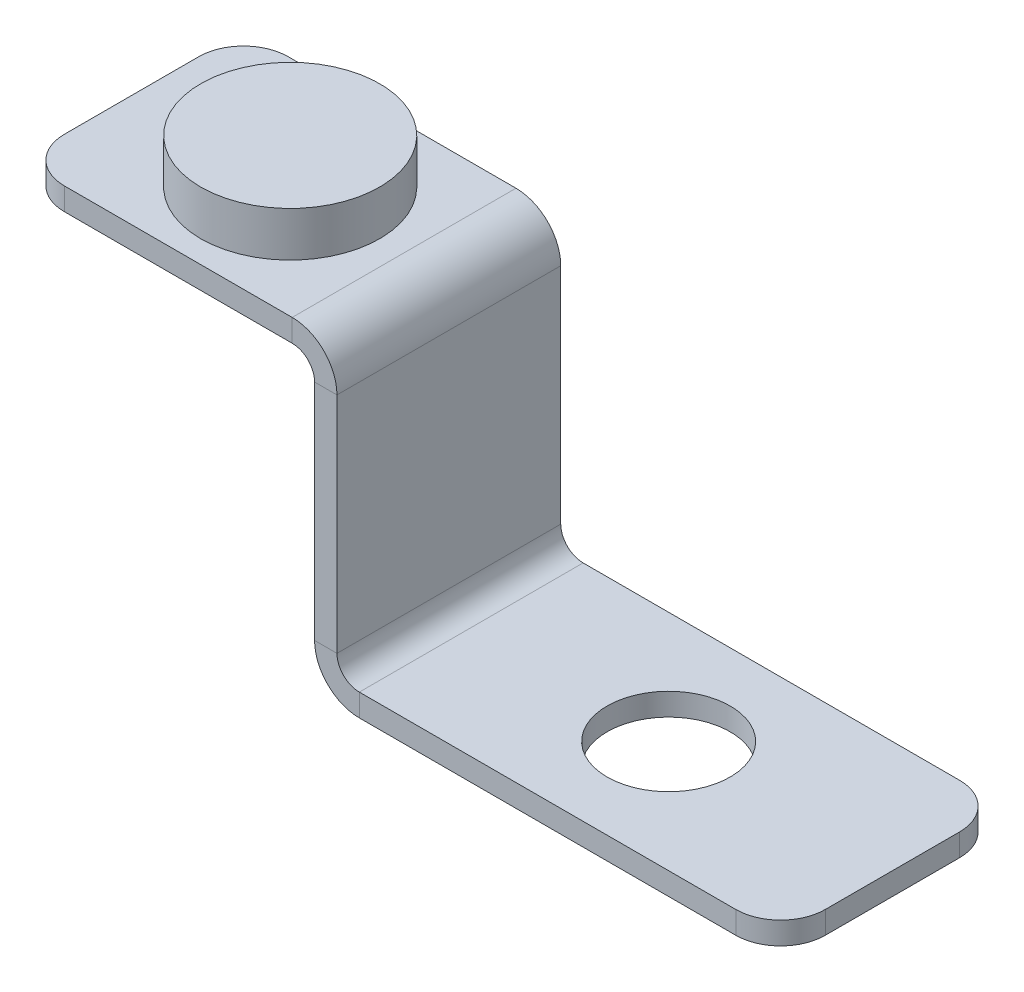
ISO-10303-21;
HEADER;
FILE_DESCRIPTION(('STEP AP214'),'2;1');
FILE_NAME('part.step','',(''),(''),'','','');
FILE_SCHEMA(('AUTOMOTIVE_DESIGN { 1 0 10303 214 1 1 1 1 }'));
ENDSEC;
DATA;
#1=APPLICATION_CONTEXT('core data for automotive mechanical design processes');
#2=APPLICATION_PROTOCOL_DEFINITION('international standard','automotive_design',2000,#1);
#3=PRODUCT_CONTEXT('',#1,'mechanical');
#4=PRODUCT('Part','Part','',(#3));
#5=PRODUCT_RELATED_PRODUCT_CATEGORY('part','',(#4));
#6=PRODUCT_DEFINITION_FORMATION('','',#4);
#7=PRODUCT_DEFINITION_CONTEXT('part definition',#1,'design');
#8=PRODUCT_DEFINITION('design','',#6,#7);
#9=PRODUCT_DEFINITION_SHAPE('','',#8);
#10=(LENGTH_UNIT() NAMED_UNIT(*) SI_UNIT(.MILLI.,.METRE.));
#11=(NAMED_UNIT(*) PLANE_ANGLE_UNIT() SI_UNIT($,.RADIAN.));
#12=(NAMED_UNIT(*) SI_UNIT($,.STERADIAN.) SOLID_ANGLE_UNIT());
#13=UNCERTAINTY_MEASURE_WITH_UNIT(LENGTH_MEASURE(1.E-05),#10,'distance_accuracy_value','');
#14=(GEOMETRIC_REPRESENTATION_CONTEXT(3) GLOBAL_UNCERTAINTY_ASSIGNED_CONTEXT((#13)) GLOBAL_UNIT_ASSIGNED_CONTEXT((#10,
#11,#12)) REPRESENTATION_CONTEXT('',''));
#15=CARTESIAN_POINT('',(0.,0.,0.));
#16=DIRECTION('',(0.,0.,1.));
#17=DIRECTION('',(1.,0.,0.));
#18=AXIS2_PLACEMENT_3D('',#15,#16,#17);
#19=CARTESIAN_POINT('',(-4.63588559708904,15.,-0.188227046115493));
#20=DIRECTION('',(0.,-1.,0.));
#21=DIRECTION('',(0.,0.,-1.));
#22=AXIS2_PLACEMENT_3D('',#19,#20,#21);
#23=CYLINDRICAL_SURFACE('',#22,4.);
#24=CARTESIAN_POINT('',(-4.63588559708904,15.,-0.188227046115493));
#25=DIRECTION('',(0.,1.,0.));
#26=DIRECTION('',(0.,0.,1.));
#27=AXIS2_PLACEMENT_3D('',#24,#25,#26);
#28=CIRCLE('',#27,4.);
#29=CARTESIAN_POINT('',(-4.63588559708904,15.,3.81177295388451));
#30=VERTEX_POINT('',#29);
#31=EDGE_CURVE('E12',#30,#30,#28,.T.);
#32=ORIENTED_EDGE('',*,*,#31,.F.);
#33=EDGE_LOOP('',(#32));
#34=FACE_BOUND('',#33,.T.);
#35=CARTESIAN_POINT('',(-4.63588559708904,13.,-0.188227046115493));
#36=DIRECTION('',(0.,1.,0.));
#37=DIRECTION('',(0.,0.,1.));
#38=AXIS2_PLACEMENT_3D('',#35,#36,#37);
#39=CIRCLE('',#38,4.);
#40=CARTESIAN_POINT('',(-4.63588559708904,13.,3.81177295388451));
#41=VERTEX_POINT('',#40);
#42=EDGE_CURVE('E61',#41,#41,#39,.T.);
#43=ORIENTED_EDGE('',*,*,#42,.T.);
#44=EDGE_LOOP('',(#43));
#45=FACE_BOUND('',#44,.T.);
#46=ADVANCED_FACE('F58',(#34,#45),#23,.T.);
#47=CARTESIAN_POINT('',(-4.63588559708904,15.,-0.188227046115493));
#48=DIRECTION('',(0.,1.,0.));
#49=DIRECTION('',(0.,0.,1.));
#50=AXIS2_PLACEMENT_3D('',#47,#48,#49);
#51=PLANE('',#50);
#52=ORIENTED_EDGE('',*,*,#31,.T.);
#53=EDGE_LOOP('',(#52));
#54=FACE_BOUND('',#53,.T.);
#55=ADVANCED_FACE('F73',(#54),#51,.T.);
#56=CARTESIAN_POINT('',(-4.63588559708904,13.,-0.188227046115493));
#57=DIRECTION('',(0.,1.,0.));
#58=DIRECTION('',(0.,0.,1.));
#59=AXIS2_PLACEMENT_3D('',#56,#57,#58);
#60=PLANE('',#59);
#61=ORIENTED_EDGE('',*,*,#42,.F.);
#62=EDGE_LOOP('',(#61));
#63=FACE_BOUND('',#62,.T.);
#64=ADVANCED_FACE('F71',(#63),#60,.F.);
#65=CLOSED_SHELL('',(#46,#55,#64));
#66=MANIFOLD_SOLID_BREP('B2',#65);
#67=CARTESIAN_POINT('',(1.45316302545895,-18.1780972450962,2.81177295388451));
#68=DIRECTION('',(1.,0.,0.));
#69=DIRECTION('',(0.,0.,1.));
#70=AXIS2_PLACEMENT_3D('',#67,#68,#69);
#71=PLANE('',#70);
#72=DIRECTION('',(0.,-1.,0.));
#73=VECTOR('',#72,1.);
#74=CARTESIAN_POINT('',(1.45316302545905,11.8219027549038,4.81177295388451));
#75=LINE('',#74,#73);
#76=CARTESIAN_POINT('',(1.45316302545905,11.,4.81177295388451));
#77=VERTEX_POINT('',#76);
#78=CARTESIAN_POINT('',(1.45316302545902,1.00000000000001,4.81177295388451));
#79=VERTEX_POINT('',#78);
#80=EDGE_CURVE('E108',#77,#79,#75,.T.);
#81=ORIENTED_EDGE('',*,*,#80,.F.);
#82=DIRECTION('',(0.,0.,-1.));
#83=VECTOR('',#82,1.);
#84=CARTESIAN_POINT('',(1.45316302545905,11.,2.81177295388451));
#85=LINE('',#84,#83);
#86=CARTESIAN_POINT('',(1.45316302545905,11.,-5.1882270461155));
#87=VERTEX_POINT('',#86);
#88=EDGE_CURVE('E336',#77,#87,#85,.T.);
#89=ORIENTED_EDGE('',*,*,#88,.T.);
#90=DIRECTION('',(0.,1.,0.));
#91=VECTOR('',#90,1.);
#92=CARTESIAN_POINT('',(1.45316302545905,11.8219027549038,-5.1882270461155));
#93=LINE('',#92,#91);
#94=CARTESIAN_POINT('',(1.45316302545901,1.00000000000001,-5.1882270461155));
#95=VERTEX_POINT('',#94);
#96=EDGE_CURVE('E344',#95,#87,#93,.T.);
#97=ORIENTED_EDGE('',*,*,#96,.F.);
#98=DIRECTION('',(0.,0.,-1.));
#99=VECTOR('',#98,1.);
#100=CARTESIAN_POINT('',(1.45316302545902,1.00000000000001,2.81177295388451));
#101=LINE('',#100,#99);
#102=EDGE_CURVE('E327',#79,#95,#101,.T.);
#103=ORIENTED_EDGE('',*,*,#102,.F.);
#104=EDGE_LOOP('',(#81,#89,#97,#103));
#105=FACE_BOUND('',#104,.T.);
#106=ADVANCED_FACE('F104',(#105),#71,.F.);
#107=CARTESIAN_POINT('',(1.45316302545905,11.8219027549038,4.81177295388451));
#108=DIRECTION('',(0.,0.,1.));
#109=DIRECTION('',(0.,-1.,0.));
#110=AXIS2_PLACEMENT_3D('',#107,#108,#109);
#111=PLANE('',#110);
#112=DIRECTION('',(1.,0.,0.));
#113=VECTOR('',#112,1.);
#114=CARTESIAN_POINT('',(1.45316302545905,11.,4.81177295388451));
#115=LINE('',#114,#113);
#116=CARTESIAN_POINT('',(2.45316302545905,11.,4.81177295388451));
#117=VERTEX_POINT('',#116);
#118=EDGE_CURVE('E339',#77,#117,#115,.T.);
#119=ORIENTED_EDGE('',*,*,#118,.F.);
#120=ORIENTED_EDGE('',*,*,#80,.T.);
#121=DIRECTION('',(1.,0.,0.));
#122=VECTOR('',#121,1.);
#123=CARTESIAN_POINT('',(1.45316302545902,1.00000000000001,4.81177295388451));
#124=LINE('',#123,#122);
#125=CARTESIAN_POINT('',(2.45316302545902,1.,4.81177295388451));
#126=VERTEX_POINT('',#125);
#127=EDGE_CURVE('E334',#79,#126,#124,.T.);
#128=ORIENTED_EDGE('',*,*,#127,.T.);
#129=DIRECTION('',(0.,-1.,0.));
#130=VECTOR('',#129,1.);
#131=CARTESIAN_POINT('',(2.45316302545905,11.8219027549038,4.81177295388451));
#132=LINE('',#131,#130);
#133=EDGE_CURVE('E129',#117,#126,#132,.T.);
#134=ORIENTED_EDGE('',*,*,#133,.F.);
#135=EDGE_LOOP('',(#119,#120,#128,#134));
#136=FACE_BOUND('',#135,.T.);
#137=ADVANCED_FACE('F350',(#136),#111,.T.);
#138=CARTESIAN_POINT('',(1.45316302545905,11.8219027549038,-5.1882270461155));
#139=DIRECTION('',(0.,0.,-1.));
#140=DIRECTION('',(0.,1.,0.));
#141=AXIS2_PLACEMENT_3D('',#138,#139,#140);
#142=PLANE('',#141);
#143=DIRECTION('',(-1.,0.,0.));
#144=VECTOR('',#143,1.);
#145=CARTESIAN_POINT('',(1.45316302545905,11.,-5.1882270461155));
#146=LINE('',#145,#144);
#147=CARTESIAN_POINT('',(2.45316302545905,11.,-5.1882270461155));
#148=VERTEX_POINT('',#147);
#149=EDGE_CURVE('E56',#148,#87,#146,.T.);
#150=ORIENTED_EDGE('',*,*,#149,.F.);
#151=DIRECTION('',(0.,1.,0.));
#152=VECTOR('',#151,1.);
#153=CARTESIAN_POINT('',(2.45316302545905,11.8219027549038,-5.1882270461155));
#154=LINE('',#153,#152);
#155=CARTESIAN_POINT('',(2.45316302545901,1.,-5.18822704611549));
#156=VERTEX_POINT('',#155);
#157=EDGE_CURVE('E121',#156,#148,#154,.T.);
#158=ORIENTED_EDGE('',*,*,#157,.F.);
#159=DIRECTION('',(-1.,0.,0.));
#160=VECTOR('',#159,1.);
#161=CARTESIAN_POINT('',(1.45316302545902,1.00000000000001,-5.18822704611549));
#162=LINE('',#161,#160);
#163=EDGE_CURVE('E330',#156,#95,#162,.T.);
#164=ORIENTED_EDGE('',*,*,#163,.T.);
#165=ORIENTED_EDGE('',*,*,#96,.T.);
#166=EDGE_LOOP('',(#150,#158,#164,#165));
#167=FACE_BOUND('',#166,.T.);
#168=ADVANCED_FACE('F106',(#167),#142,.T.);
#169=CARTESIAN_POINT('',(2.45316302545895,-18.1780972450962,2.81177295388451));
#170=DIRECTION('',(1.,0.,0.));
#171=DIRECTION('',(0.,0.,1.));
#172=AXIS2_PLACEMENT_3D('',#169,#170,#171);
#173=PLANE('',#172);
#174=DIRECTION('',(0.,0.,-1.));
#175=VECTOR('',#174,1.);
#176=CARTESIAN_POINT('',(2.45316302545905,11.,2.81177295388451));
#177=LINE('',#176,#175);
#178=EDGE_CURVE('E113',#117,#148,#177,.T.);
#179=ORIENTED_EDGE('',*,*,#178,.F.);
#180=ORIENTED_EDGE('',*,*,#133,.T.);
#181=DIRECTION('',(0.,0.,-1.));
#182=VECTOR('',#181,1.);
#183=CARTESIAN_POINT('',(2.45316302545902,1.,2.81177295388451));
#184=LINE('',#183,#182);
#185=EDGE_CURVE('E332',#126,#156,#184,.T.);
#186=ORIENTED_EDGE('',*,*,#185,.T.);
#187=ORIENTED_EDGE('',*,*,#157,.T.);
#188=EDGE_LOOP('',(#179,#180,#186,#187));
#189=FACE_BOUND('',#188,.T.);
#190=ADVANCED_FACE('F346',(#189),#173,.T.);
#191=CARTESIAN_POINT('',(20.2750657803628,-1.,2.81177295388451));
#192=DIRECTION('',(0.,1.,0.));
#193=DIRECTION('',(0.,0.,1.));
#194=AXIS2_PLACEMENT_3D('',#191,#192,#193);
#195=CYLINDRICAL_SURFACE('',#194,2.);
#196=CARTESIAN_POINT('',(20.2750657803628,0.,2.81177295388451));
#197=DIRECTION('',(0.,1.,0.));
#198=DIRECTION('',(0.,0.,1.));
#199=AXIS2_PLACEMENT_3D('',#196,#197,#198);
#200=CIRCLE('',#199,2.);
#201=CARTESIAN_POINT('',(20.2750657803628,0.,4.81177295388451));
#202=VERTEX_POINT('',#201);
#203=CARTESIAN_POINT('',(22.2750657803628,0.,2.81177295388449));
#204=VERTEX_POINT('',#203);
#205=EDGE_CURVE('E288',#202,#204,#200,.T.);
#206=ORIENTED_EDGE('',*,*,#205,.F.);
#207=DIRECTION('',(0.,1.,0.));
#208=VECTOR('',#207,1.);
#209=CARTESIAN_POINT('',(20.2750657803628,-1.,4.81177295388451));
#210=LINE('',#209,#208);
#211=CARTESIAN_POINT('',(20.2750657803628,-1.,4.81177295388451));
#212=VERTEX_POINT('',#211);
#213=EDGE_CURVE('E275',#212,#202,#210,.T.);
#214=ORIENTED_EDGE('',*,*,#213,.F.);
#215=CARTESIAN_POINT('',(20.2750657803628,-1.,2.81177295388451));
#216=DIRECTION('',(0.,1.,0.));
#217=DIRECTION('',(0.,0.,1.));
#218=AXIS2_PLACEMENT_3D('',#215,#216,#217);
#219=CIRCLE('',#218,2.);
#220=CARTESIAN_POINT('',(22.2750657803628,-1.,2.81177295388449));
#221=VERTEX_POINT('',#220);
#222=EDGE_CURVE('E316',#212,#221,#219,.T.);
#223=ORIENTED_EDGE('',*,*,#222,.T.);
#224=DIRECTION('',(0.,1.,0.));
#225=VECTOR('',#224,1.);
#226=CARTESIAN_POINT('',(22.2750657803628,-1.,2.81177295388449));
#227=LINE('',#226,#225);
#228=EDGE_CURVE('E314',#221,#204,#227,.T.);
#229=ORIENTED_EDGE('',*,*,#228,.T.);
#230=EDGE_LOOP('',(#206,#214,#223,#229));
#231=FACE_BOUND('',#230,.T.);
#232=ADVANCED_FACE('F390',(#231),#195,.T.);
#233=CARTESIAN_POINT('',(22.2750657803628,-1.,-3.18822704611548));
#234=DIRECTION('',(1.,0.,0.));
#235=DIRECTION('',(0.,0.,-1.));
#236=AXIS2_PLACEMENT_3D('',#233,#234,#235);
#237=PLANE('',#236);
#238=DIRECTION('',(0.,0.,-1.));
#239=VECTOR('',#238,1.);
#240=CARTESIAN_POINT('',(22.2750657803628,0.,-3.18822704611548));
#241=LINE('',#240,#239);
#242=CARTESIAN_POINT('',(22.2750657803628,0.,-3.18822704611548));
#243=VERTEX_POINT('',#242);
#244=EDGE_CURVE('E285',#204,#243,#241,.T.);
#245=ORIENTED_EDGE('',*,*,#244,.F.);
#246=ORIENTED_EDGE('',*,*,#228,.F.);
#247=DIRECTION('',(0.,0.,-1.));
#248=VECTOR('',#247,1.);
#249=CARTESIAN_POINT('',(22.2750657803628,-1.,-3.18822704611548));
#250=LINE('',#249,#248);
#251=CARTESIAN_POINT('',(22.2750657803628,-1.,-3.18822704611548));
#252=VERTEX_POINT('',#251);
#253=EDGE_CURVE('E311',#221,#252,#250,.T.);
#254=ORIENTED_EDGE('',*,*,#253,.T.);
#255=DIRECTION('',(0.,1.,0.));
#256=VECTOR('',#255,1.);
#257=CARTESIAN_POINT('',(22.2750657803628,-1.,-3.18822704611548));
#258=LINE('',#257,#256);
#259=EDGE_CURVE('E309',#252,#243,#258,.T.);
#260=ORIENTED_EDGE('',*,*,#259,.T.);
#261=EDGE_LOOP('',(#245,#246,#254,#260));
#262=FACE_BOUND('',#261,.T.);
#263=ADVANCED_FACE('F393',(#262),#237,.T.);
#264=CARTESIAN_POINT('',(20.2750657803628,-1.,-3.18822704611549));
#265=DIRECTION('',(0.,1.,0.));
#266=DIRECTION('',(0.,0.,1.));
#267=AXIS2_PLACEMENT_3D('',#264,#265,#266);
#268=CYLINDRICAL_SURFACE('',#267,2.);
#269=CARTESIAN_POINT('',(20.2750657803628,0.,-3.18822704611549));
#270=DIRECTION('',(0.,1.,0.));
#271=DIRECTION('',(0.,0.,-1.));
#272=AXIS2_PLACEMENT_3D('',#269,#270,#271);
#273=CIRCLE('',#272,2.);
#274=CARTESIAN_POINT('',(20.2750657803628,0.,-5.18822704611549));
#275=VERTEX_POINT('',#274);
#276=EDGE_CURVE('E282',#243,#275,#273,.T.);
#277=ORIENTED_EDGE('',*,*,#276,.F.);
#278=ORIENTED_EDGE('',*,*,#259,.F.);
#279=CARTESIAN_POINT('',(20.2750657803628,-1.,-3.18822704611549));
#280=DIRECTION('',(0.,1.,0.));
#281=DIRECTION('',(0.,0.,-1.));
#282=AXIS2_PLACEMENT_3D('',#279,#280,#281);
#283=CIRCLE('',#282,2.);
#284=CARTESIAN_POINT('',(20.2750657803628,-1.,-5.18822704611549));
#285=VERTEX_POINT('',#284);
#286=EDGE_CURVE('E306',#252,#285,#283,.T.);
#287=ORIENTED_EDGE('',*,*,#286,.T.);
#288=DIRECTION('',(0.,1.,0.));
#289=VECTOR('',#288,1.);
#290=CARTESIAN_POINT('',(20.2750657803628,-1.,-5.18822704611549));
#291=LINE('',#290,#289);
#292=EDGE_CURVE('E304',#285,#275,#291,.T.);
#293=ORIENTED_EDGE('',*,*,#292,.T.);
#294=EDGE_LOOP('',(#277,#278,#287,#293));
#295=FACE_BOUND('',#294,.T.);
#296=ADVANCED_FACE('F395',(#295),#268,.T.);
#297=CARTESIAN_POINT('',(12.2750657803628,-1.,-0.188227046115493));
#298=DIRECTION('',(0.,1.,0.));
#299=DIRECTION('',(0.,0.,1.));
#300=AXIS2_PLACEMENT_3D('',#297,#298,#299);
#301=CYLINDRICAL_SURFACE('',#300,2.75);
#302=CARTESIAN_POINT('',(12.2750657803628,-1.,-0.188227046115493));
#303=DIRECTION('',(0.,1.,0.));
#304=DIRECTION('',(0.,0.,1.));
#305=AXIS2_PLACEMENT_3D('',#302,#303,#304);
#306=CIRCLE('',#305,2.75);
#307=CARTESIAN_POINT('',(12.2750657803628,-1.,2.5617729538845));
#308=VERTEX_POINT('',#307);
#309=EDGE_CURVE('E298',#308,#308,#306,.T.);
#310=ORIENTED_EDGE('',*,*,#309,.F.);
#311=EDGE_LOOP('',(#310));
#312=FACE_BOUND('',#311,.T.);
#313=CARTESIAN_POINT('',(12.2750657803628,0.,-0.188227046115493));
#314=DIRECTION('',(0.,1.,0.));
#315=DIRECTION('',(0.,0.,1.));
#316=AXIS2_PLACEMENT_3D('',#313,#314,#315);
#317=CIRCLE('',#316,2.75);
#318=CARTESIAN_POINT('',(12.2750657803628,0.,2.5617729538845));
#319=VERTEX_POINT('',#318);
#320=EDGE_CURVE('E301',#319,#319,#317,.T.);
#321=ORIENTED_EDGE('',*,*,#320,.T.);
#322=EDGE_LOOP('',(#321));
#323=FACE_BOUND('',#322,.T.);
#324=ADVANCED_FACE('F397',(#312,#323),#301,.F.);
#325=CARTESIAN_POINT('',(20.2750657803628,-1.,2.81177295388451));
#326=DIRECTION('',(0.,1.,0.));
#327=DIRECTION('',(0.,0.,1.));
#328=AXIS2_PLACEMENT_3D('',#325,#326,#327);
#329=PLANE('',#328);
#330=ORIENTED_EDGE('',*,*,#309,.T.);
#331=EDGE_LOOP('',(#330));
#332=FACE_BOUND('',#331,.T.);
#333=DIRECTION('',(1.,0.,0.));
#334=VECTOR('',#333,1.);
#335=CARTESIAN_POINT('',(-9.72493421963715,-1.,4.81177295388451));
#336=LINE('',#335,#334);
#337=CARTESIAN_POINT('',(3.45316302545902,-1.,4.81177295388451));
#338=VERTEX_POINT('',#337);
#339=EDGE_CURVE('E278',#338,#212,#336,.T.);
#340=ORIENTED_EDGE('',*,*,#339,.F.);
#341=DIRECTION('',(0.,0.,-1.));
#342=VECTOR('',#341,1.);
#343=CARTESIAN_POINT('',(3.45316302545902,-1.,2.81177295388451));
#344=LINE('',#343,#342);
#345=CARTESIAN_POINT('',(3.45316302545902,-1.,-5.18822704611549));
#346=VERTEX_POINT('',#345);
#347=EDGE_CURVE('E295',#338,#346,#344,.T.);
#348=ORIENTED_EDGE('',*,*,#347,.T.);
#349=DIRECTION('',(-1.,0.,0.));
#350=VECTOR('',#349,1.);
#351=CARTESIAN_POINT('',(-9.72493421963715,-1.,-5.18822704611549));
#352=LINE('',#351,#350);
#353=EDGE_CURVE('E293',#285,#346,#352,.T.);
#354=ORIENTED_EDGE('',*,*,#353,.F.);
#355=ORIENTED_EDGE('',*,*,#286,.F.);
#356=ORIENTED_EDGE('',*,*,#253,.F.);
#357=ORIENTED_EDGE('',*,*,#222,.F.);
#358=EDGE_LOOP('',(#340,#348,#354,#355,#356,#357));
#359=FACE_BOUND('',#358,.T.);
#360=ADVANCED_FACE('F385',(#332,#359),#329,.F.);
#361=CARTESIAN_POINT('',(-9.72493421963715,-1.,-5.18822704611549));
#362=DIRECTION('',(0.,0.,-1.));
#363=DIRECTION('',(-1.,0.,0.));
#364=AXIS2_PLACEMENT_3D('',#361,#362,#363);
#365=PLANE('',#364);
#366=DIRECTION('',(0.,-1.,0.));
#367=VECTOR('',#366,1.);
#368=CARTESIAN_POINT('',(3.45316302545902,-1.,-5.18822704611549));
#369=LINE('',#368,#367);
#370=CARTESIAN_POINT('',(3.45316302545902,0.,-5.18822704611549));
#371=VERTEX_POINT('',#370);
#372=EDGE_CURVE('E319',#371,#346,#369,.T.);
#373=ORIENTED_EDGE('',*,*,#372,.F.);
#374=DIRECTION('',(-1.,0.,0.));
#375=VECTOR('',#374,1.);
#376=CARTESIAN_POINT('',(-9.72493421963715,0.,-5.18822704611549));
#377=LINE('',#376,#375);
#378=EDGE_CURVE('E280',#275,#371,#377,.T.);
#379=ORIENTED_EDGE('',*,*,#378,.F.);
#380=ORIENTED_EDGE('',*,*,#292,.F.);
#381=ORIENTED_EDGE('',*,*,#353,.T.);
#382=EDGE_LOOP('',(#373,#379,#380,#381));
#383=FACE_BOUND('',#382,.T.);
#384=ADVANCED_FACE('F373',(#383),#365,.T.);
#385=CARTESIAN_POINT('',(20.2750657803628,0.,2.81177295388451));
#386=DIRECTION('',(0.,1.,0.));
#387=DIRECTION('',(0.,0.,1.));
#388=AXIS2_PLACEMENT_3D('',#385,#386,#387);
#389=PLANE('',#388);
#390=DIRECTION('',(0.,0.,-1.));
#391=VECTOR('',#390,1.);
#392=CARTESIAN_POINT('',(3.45316302545902,0.,2.81177295388451));
#393=LINE('',#392,#391);
#394=CARTESIAN_POINT('',(3.45316302545902,0.,4.81177295388451));
#395=VERTEX_POINT('',#394);
#396=EDGE_CURVE('E322',#395,#371,#393,.T.);
#397=ORIENTED_EDGE('',*,*,#396,.F.);
#398=DIRECTION('',(1.,0.,0.));
#399=VECTOR('',#398,1.);
#400=CARTESIAN_POINT('',(-9.72493421963715,0.,4.81177295388451));
#401=LINE('',#400,#399);
#402=EDGE_CURVE('E291',#395,#202,#401,.T.);
#403=ORIENTED_EDGE('',*,*,#402,.T.);
#404=ORIENTED_EDGE('',*,*,#205,.T.);
#405=ORIENTED_EDGE('',*,*,#244,.T.);
#406=ORIENTED_EDGE('',*,*,#276,.T.);
#407=ORIENTED_EDGE('',*,*,#378,.T.);
#408=EDGE_LOOP('',(#397,#403,#404,#405,#406,#407));
#409=FACE_BOUND('',#408,.T.);
#410=ORIENTED_EDGE('',*,*,#320,.F.);
#411=EDGE_LOOP('',(#410));
#412=FACE_BOUND('',#411,.T.);
#413=ADVANCED_FACE('F367',(#409,#412),#389,.T.);
#414=CARTESIAN_POINT('',(-9.72493421963715,-1.,4.81177295388451));
#415=DIRECTION('',(0.,0.,1.));
#416=DIRECTION('',(1.,0.,0.));
#417=AXIS2_PLACEMENT_3D('',#414,#415,#416);
#418=PLANE('',#417);
#419=DIRECTION('',(0.,1.,0.));
#420=VECTOR('',#419,1.);
#421=CARTESIAN_POINT('',(3.45316302545902,-1.,4.81177295388451));
#422=LINE('',#421,#420);
#423=EDGE_CURVE('E270',#338,#395,#422,.T.);
#424=ORIENTED_EDGE('',*,*,#423,.F.);
#425=ORIENTED_EDGE('',*,*,#339,.T.);
#426=ORIENTED_EDGE('',*,*,#213,.T.);
#427=ORIENTED_EDGE('',*,*,#402,.F.);
#428=EDGE_LOOP('',(#424,#425,#426,#427));
#429=FACE_BOUND('',#428,.T.);
#430=ADVANCED_FACE('F362',(#429),#418,.T.);
#431=CARTESIAN_POINT('',(3.45316302545902,1.,4.81177295388451));
#432=DIRECTION('',(0.,0.,1.));
#433=DIRECTION('',(1.,0.,0.));
#434=AXIS2_PLACEMENT_3D('',#431,#432,#433);
#435=PLANE('',#434);
#436=ORIENTED_EDGE('',*,*,#423,.T.);
#437=CARTESIAN_POINT('',(3.45316302545902,1.,4.81177295388451));
#438=DIRECTION('',(0.,0.,-1.));
#439=DIRECTION('',(-1.,0.,0.));
#440=AXIS2_PLACEMENT_3D('',#437,#438,#439);
#441=CIRCLE('',#440,1.);
#442=EDGE_CURVE('E258',#395,#126,#441,.T.);
#443=ORIENTED_EDGE('',*,*,#442,.T.);
#444=ORIENTED_EDGE('',*,*,#127,.F.);
#445=CARTESIAN_POINT('',(3.45316302545902,1.,4.81177295388451));
#446=DIRECTION('',(0.,0.,-1.));
#447=DIRECTION('',(1.,0.,0.));
#448=AXIS2_PLACEMENT_3D('',#445,#446,#447);
#449=CIRCLE('',#448,2.);
#450=EDGE_CURVE('E263',#338,#79,#449,.T.);
#451=ORIENTED_EDGE('',*,*,#450,.F.);
#452=EDGE_LOOP('',(#436,#443,#444,#451));
#453=FACE_BOUND('',#452,.T.);
#454=ADVANCED_FACE('F358',(#453),#435,.T.);
#455=CARTESIAN_POINT('',(3.45316302545901,1.,-5.18822704611549));
#456=DIRECTION('',(0.,0.,-1.));
#457=DIRECTION('',(-1.,0.,0.));
#458=AXIS2_PLACEMENT_3D('',#455,#456,#457);
#459=PLANE('',#458);
#460=ORIENTED_EDGE('',*,*,#163,.F.);
#461=CARTESIAN_POINT('',(3.45316302545901,1.,-5.18822704611549));
#462=DIRECTION('',(0.,0.,-1.));
#463=DIRECTION('',(-1.,0.,0.));
#464=AXIS2_PLACEMENT_3D('',#461,#462,#463);
#465=CIRCLE('',#464,1.);
#466=EDGE_CURVE('E267',#156,#371,#465,.F.);
#467=ORIENTED_EDGE('',*,*,#466,.T.);
#468=ORIENTED_EDGE('',*,*,#372,.T.);
#469=CARTESIAN_POINT('',(3.45316302545901,1.,-5.18822704611549));
#470=DIRECTION('',(0.,0.,1.));
#471=DIRECTION('',(-1.,0.,0.));
#472=AXIS2_PLACEMENT_3D('',#469,#470,#471);
#473=CIRCLE('',#472,2.);
#474=EDGE_CURVE('E266',#95,#346,#473,.T.);
#475=ORIENTED_EDGE('',*,*,#474,.F.);
#476=EDGE_LOOP('',(#460,#467,#468,#475));
#477=FACE_BOUND('',#476,.T.);
#478=ADVANCED_FACE('F377',(#477),#459,.T.);
#479=CARTESIAN_POINT('',(3.45316302545902,1.,10.1341589414173));
#480=DIRECTION('',(0.,0.,-1.));
#481=DIRECTION('',(-1.,0.,0.));
#482=AXIS2_PLACEMENT_3D('',#479,#480,#481);
#483=CYLINDRICAL_SURFACE('',#482,2.);
#484=ORIENTED_EDGE('',*,*,#474,.T.);
#485=ORIENTED_EDGE('',*,*,#347,.F.);
#486=ORIENTED_EDGE('',*,*,#450,.T.);
#487=ORIENTED_EDGE('',*,*,#102,.T.);
#488=EDGE_LOOP('',(#484,#485,#486,#487));
#489=FACE_BOUND('',#488,.T.);
#490=ADVANCED_FACE('F383',(#489),#483,.T.);
#491=CARTESIAN_POINT('',(3.45316302545902,1.,10.1341589414173));
#492=DIRECTION('',(0.,0.,-1.));
#493=DIRECTION('',(-1.,0.,0.));
#494=AXIS2_PLACEMENT_3D('',#491,#492,#493);
#495=CYLINDRICAL_SURFACE('',#494,1.);
#496=ORIENTED_EDGE('',*,*,#466,.F.);
#497=ORIENTED_EDGE('',*,*,#185,.F.);
#498=ORIENTED_EDGE('',*,*,#442,.F.);
#499=ORIENTED_EDGE('',*,*,#396,.T.);
#500=EDGE_LOOP('',(#496,#497,#498,#499));
#501=FACE_BOUND('',#500,.T.);
#502=ADVANCED_FACE('F357',(#501),#495,.F.);
#503=CARTESIAN_POINT('',(0.453163025459052,11.,4.81177295388451));
#504=DIRECTION('',(0.,0.,-1.));
#505=DIRECTION('',(-1.,0.,0.));
#506=AXIS2_PLACEMENT_3D('',#503,#504,#505);
#507=PLANE('',#506);
#508=ORIENTED_EDGE('',*,*,#118,.T.);
#509=CARTESIAN_POINT('',(0.453163025459052,11.,4.81177295388451));
#510=DIRECTION('',(0.,0.,-1.));
#511=DIRECTION('',(-1.,0.,0.));
#512=AXIS2_PLACEMENT_3D('',#509,#510,#511);
#513=CIRCLE('',#512,2.);
#514=CARTESIAN_POINT('',(0.453163025459055,13.,4.81177295388451));
#515=VERTEX_POINT('',#514);
#516=EDGE_CURVE('E237',#117,#515,#513,.F.);
#517=ORIENTED_EDGE('',*,*,#516,.T.);
#518=DIRECTION('',(0.,1.,0.));
#519=VECTOR('',#518,1.);
#520=CARTESIAN_POINT('',(0.453163025459055,12.,4.81177295388451));
#521=LINE('',#520,#519);
#522=CARTESIAN_POINT('',(0.453163025459049,12.,4.81177295388451));
#523=VERTEX_POINT('',#522);
#524=EDGE_CURVE('E746',#523,#515,#521,.T.);
#525=ORIENTED_EDGE('',*,*,#524,.F.);
#526=CARTESIAN_POINT('',(0.453163025459052,11.,4.81177295388451));
#527=DIRECTION('',(0.,0.,1.));
#528=DIRECTION('',(-1.,0.,0.));
#529=AXIS2_PLACEMENT_3D('',#526,#527,#528);
#530=CIRCLE('',#529,1.);
#531=EDGE_CURVE('E251',#77,#523,#530,.T.);
#532=ORIENTED_EDGE('',*,*,#531,.F.);
#533=EDGE_LOOP('',(#508,#517,#525,#532));
#534=FACE_BOUND('',#533,.T.);
#535=ADVANCED_FACE('F595',(#534),#507,.F.);
#536=CARTESIAN_POINT('',(0.45316302545905,11.,-5.1882270461155));
#537=DIRECTION('',(0.,0.,1.));
#538=DIRECTION('',(1.,0.,0.));
#539=AXIS2_PLACEMENT_3D('',#536,#537,#538);
#540=PLANE('',#539);
#541=DIRECTION('',(0.,-1.,0.));
#542=VECTOR('',#541,1.);
#543=CARTESIAN_POINT('',(0.453163025459053,12.,-5.1882270461155));
#544=LINE('',#543,#542);
#545=CARTESIAN_POINT('',(0.453163025459053,13.,-5.1882270461155));
#546=VERTEX_POINT('',#545);
#547=CARTESIAN_POINT('',(0.453163025459047,12.,-5.1882270461155));
#548=VERTEX_POINT('',#547);
#549=EDGE_CURVE('E226',#546,#548,#544,.T.);
#550=ORIENTED_EDGE('',*,*,#549,.F.);
#551=CARTESIAN_POINT('',(0.45316302545905,11.,-5.1882270461155));
#552=DIRECTION('',(0.,0.,-1.));
#553=DIRECTION('',(-1.,0.,0.));
#554=AXIS2_PLACEMENT_3D('',#551,#552,#553);
#555=CIRCLE('',#554,2.);
#556=EDGE_CURVE('E255',#546,#148,#555,.T.);
#557=ORIENTED_EDGE('',*,*,#556,.T.);
#558=ORIENTED_EDGE('',*,*,#149,.T.);
#559=CARTESIAN_POINT('',(0.45316302545905,11.,-5.1882270461155));
#560=DIRECTION('',(0.,0.,-1.));
#561=DIRECTION('',(1.,0.,0.));
#562=AXIS2_PLACEMENT_3D('',#559,#560,#561);
#563=CIRCLE('',#562,1.);
#564=EDGE_CURVE('E254',#548,#87,#563,.T.);
#565=ORIENTED_EDGE('',*,*,#564,.F.);
#566=EDGE_LOOP('',(#550,#557,#558,#565));
#567=FACE_BOUND('',#566,.T.);
#568=ADVANCED_FACE('F603',(#567),#540,.F.);
#569=CARTESIAN_POINT('',(0.453163025459053,11.,10.1341589414173));
#570=DIRECTION('',(0.,0.,-1.));
#571=DIRECTION('',(-1.,0.,0.));
#572=AXIS2_PLACEMENT_3D('',#569,#570,#571);
#573=CYLINDRICAL_SURFACE('',#572,1.);
#574=ORIENTED_EDGE('',*,*,#564,.T.);
#575=ORIENTED_EDGE('',*,*,#88,.F.);
#576=ORIENTED_EDGE('',*,*,#531,.T.);
#577=DIRECTION('',(0.,0.,-1.));
#578=VECTOR('',#577,1.);
#579=CARTESIAN_POINT('',(0.453163025459049,12.,2.81177295388451));
#580=LINE('',#579,#578);
#581=EDGE_CURVE('E245',#523,#548,#580,.T.);
#582=ORIENTED_EDGE('',*,*,#581,.T.);
#583=EDGE_LOOP('',(#574,#575,#576,#582));
#584=FACE_BOUND('',#583,.T.);
#585=ADVANCED_FACE('F612',(#584),#573,.F.);
#586=CARTESIAN_POINT('',(0.453163025459053,11.,10.1341589414173));
#587=DIRECTION('',(0.,0.,-1.));
#588=DIRECTION('',(-1.,0.,0.));
#589=AXIS2_PLACEMENT_3D('',#586,#587,#588);
#590=CYLINDRICAL_SURFACE('',#589,2.);
#591=ORIENTED_EDGE('',*,*,#556,.F.);
#592=DIRECTION('',(0.,0.,-1.));
#593=VECTOR('',#592,1.);
#594=CARTESIAN_POINT('',(0.453163025459049,13.,2.81177295388451));
#595=LINE('',#594,#593);
#596=EDGE_CURVE('E740',#515,#546,#595,.T.);
#597=ORIENTED_EDGE('',*,*,#596,.F.);
#598=ORIENTED_EDGE('',*,*,#516,.F.);
#599=ORIENTED_EDGE('',*,*,#178,.T.);
#600=EDGE_LOOP('',(#591,#597,#598,#599));
#601=FACE_BOUND('',#600,.T.);
#602=ADVANCED_FACE('F488',(#601),#590,.T.);
#603=CARTESIAN_POINT('',(-9.72493421963712,12.,-3.18822704611549));
#604=DIRECTION('',(0.,1.,0.));
#605=DIRECTION('',(0.,0.,1.));
#606=AXIS2_PLACEMENT_3D('',#603,#604,#605);
#607=CYLINDRICAL_SURFACE('',#606,2.);
#608=CARTESIAN_POINT('',(-9.72493421963712,13.,-3.18822704611549));
#609=DIRECTION('',(0.,1.,0.));
#610=DIRECTION('',(0.,0.,1.));
#611=AXIS2_PLACEMENT_3D('',#608,#609,#610);
#612=CIRCLE('',#611,2.);
#613=CARTESIAN_POINT('',(-9.72493421963711,13.,-5.18822704611549));
#614=VERTEX_POINT('',#613);
#615=CARTESIAN_POINT('',(-11.7249342196371,13.,-3.18822704611548));
#616=VERTEX_POINT('',#615);
#617=EDGE_CURVE('E236',#614,#616,#612,.T.);
#618=ORIENTED_EDGE('',*,*,#617,.F.);
#619=DIRECTION('',(0.,1.,0.));
#620=VECTOR('',#619,1.);
#621=CARTESIAN_POINT('',(-9.72493421963711,12.,-5.18822704611549));
#622=LINE('',#621,#620);
#623=CARTESIAN_POINT('',(-9.72493421963711,12.,-5.18822704611549));
#624=VERTEX_POINT('',#623);
#625=EDGE_CURVE('E223',#624,#614,#622,.T.);
#626=ORIENTED_EDGE('',*,*,#625,.F.);
#627=CARTESIAN_POINT('',(-9.72493421963712,12.,-3.18822704611549));
#628=DIRECTION('',(0.,1.,0.));
#629=DIRECTION('',(0.,0.,1.));
#630=AXIS2_PLACEMENT_3D('',#627,#628,#629);
#631=CIRCLE('',#630,2.);
#632=CARTESIAN_POINT('',(-11.7249342196371,12.,-3.18822704611548));
#633=VERTEX_POINT('',#632);
#634=EDGE_CURVE('E234',#624,#633,#631,.T.);
#635=ORIENTED_EDGE('',*,*,#634,.T.);
#636=DIRECTION('',(0.,1.,0.));
#637=VECTOR('',#636,1.);
#638=CARTESIAN_POINT('',(-11.7249342196371,12.,-3.18822704611548));
#639=LINE('',#638,#637);
#640=EDGE_CURVE('E244',#633,#616,#639,.T.);
#641=ORIENTED_EDGE('',*,*,#640,.T.);
#642=EDGE_LOOP('',(#618,#626,#635,#641));
#643=FACE_BOUND('',#642,.T.);
#644=ADVANCED_FACE('F233',(#643),#607,.T.);
#645=CARTESIAN_POINT('',(-11.7249342196371,12.,-3.18822704611548));
#646=DIRECTION('',(-1.,0.,0.));
#647=DIRECTION('',(0.,0.,1.));
#648=AXIS2_PLACEMENT_3D('',#645,#646,#647);
#649=PLANE('',#648);
#650=DIRECTION('',(0.,0.,1.));
#651=VECTOR('',#650,1.);
#652=CARTESIAN_POINT('',(-11.7249342196371,13.,-3.18822704611548));
#653=LINE('',#652,#651);
#654=CARTESIAN_POINT('',(-11.7249342196371,13.,2.81177295388449));
#655=VERTEX_POINT('',#654);
#656=EDGE_CURVE('E759',#616,#655,#653,.T.);
#657=ORIENTED_EDGE('',*,*,#656,.F.);
#658=ORIENTED_EDGE('',*,*,#640,.F.);
#659=DIRECTION('',(0.,0.,1.));
#660=VECTOR('',#659,1.);
#661=CARTESIAN_POINT('',(-11.7249342196371,12.,-3.18822704611548));
#662=LINE('',#661,#660);
#663=CARTESIAN_POINT('',(-11.7249342196371,12.,2.81177295388449));
#664=VERTEX_POINT('',#663);
#665=EDGE_CURVE('E243',#633,#664,#662,.T.);
#666=ORIENTED_EDGE('',*,*,#665,.T.);
#667=DIRECTION('',(0.,1.,0.));
#668=VECTOR('',#667,1.);
#669=CARTESIAN_POINT('',(-11.7249342196371,12.,2.81177295388449));
#670=LINE('',#669,#668);
#671=EDGE_CURVE('E771',#664,#655,#670,.T.);
#672=ORIENTED_EDGE('',*,*,#671,.T.);
#673=EDGE_LOOP('',(#657,#658,#666,#672));
#674=FACE_BOUND('',#673,.T.);
#675=ADVANCED_FACE('F469',(#674),#649,.T.);
#676=CARTESIAN_POINT('',(-9.72493421963712,12.,2.81177295388451));
#677=DIRECTION('',(0.,1.,0.));
#678=DIRECTION('',(0.,0.,1.));
#679=AXIS2_PLACEMENT_3D('',#676,#677,#678);
#680=CYLINDRICAL_SURFACE('',#679,2.);
#681=CARTESIAN_POINT('',(-9.72493421963712,13.,2.81177295388451));
#682=DIRECTION('',(0.,1.,0.));
#683=DIRECTION('',(0.,0.,1.));
#684=AXIS2_PLACEMENT_3D('',#681,#682,#683);
#685=CIRCLE('',#684,2.);
#686=CARTESIAN_POINT('',(-9.72493421963711,13.,4.81177295388451));
#687=VERTEX_POINT('',#686);
#688=EDGE_CURVE('E743',#655,#687,#685,.T.);
#689=ORIENTED_EDGE('',*,*,#688,.F.);
#690=ORIENTED_EDGE('',*,*,#671,.F.);
#691=CARTESIAN_POINT('',(-9.72493421963712,12.,2.81177295388451));
#692=DIRECTION('',(0.,1.,0.));
#693=DIRECTION('',(0.,0.,1.));
#694=AXIS2_PLACEMENT_3D('',#691,#692,#693);
#695=CIRCLE('',#694,2.);
#696=CARTESIAN_POINT('',(-9.72493421963711,12.,4.81177295388451));
#697=VERTEX_POINT('',#696);
#698=EDGE_CURVE('E768',#664,#697,#695,.T.);
#699=ORIENTED_EDGE('',*,*,#698,.T.);
#700=DIRECTION('',(0.,1.,0.));
#701=VECTOR('',#700,1.);
#702=CARTESIAN_POINT('',(-9.72493421963711,12.,4.81177295388451));
#703=LINE('',#702,#701);
#704=EDGE_CURVE('E766',#697,#687,#703,.T.);
#705=ORIENTED_EDGE('',*,*,#704,.T.);
#706=EDGE_LOOP('',(#689,#690,#699,#705));
#707=FACE_BOUND('',#706,.T.);
#708=ADVANCED_FACE('F463',(#707),#680,.T.);
#709=CARTESIAN_POINT('',(31.9874547607476,12.,2.8117729538845));
#710=DIRECTION('',(0.,1.,0.));
#711=DIRECTION('',(0.,0.,1.));
#712=AXIS2_PLACEMENT_3D('',#709,#710,#711);
#713=PLANE('',#712);
#714=ORIENTED_EDGE('',*,*,#581,.F.);
#715=DIRECTION('',(1.,0.,0.));
#716=VECTOR('',#715,1.);
#717=CARTESIAN_POINT('',(1.98745476074759,12.,4.81177295388451));
#718=LINE('',#717,#716);
#719=EDGE_CURVE('E750',#697,#523,#718,.T.);
#720=ORIENTED_EDGE('',*,*,#719,.F.);
#721=ORIENTED_EDGE('',*,*,#698,.F.);
#722=ORIENTED_EDGE('',*,*,#665,.F.);
#723=ORIENTED_EDGE('',*,*,#634,.F.);
#724=DIRECTION('',(-1.,0.,0.));
#725=VECTOR('',#724,1.);
#726=CARTESIAN_POINT('',(1.98745476074759,12.,-5.1882270461155));
#727=LINE('',#726,#725);
#728=EDGE_CURVE('E220',#548,#624,#727,.T.);
#729=ORIENTED_EDGE('',*,*,#728,.F.);
#730=EDGE_LOOP('',(#714,#720,#721,#722,#723,#729));
#731=FACE_BOUND('',#730,.T.);
#732=ADVANCED_FACE('F240',(#731),#713,.F.);
#733=CARTESIAN_POINT('',(1.98745476074759,12.,4.81177295388451));
#734=DIRECTION('',(0.,0.,1.));
#735=DIRECTION('',(1.,0.,0.));
#736=AXIS2_PLACEMENT_3D('',#733,#734,#735);
#737=PLANE('',#736);
#738=ORIENTED_EDGE('',*,*,#719,.T.);
#739=ORIENTED_EDGE('',*,*,#524,.T.);
#740=DIRECTION('',(1.,0.,0.));
#741=VECTOR('',#740,1.);
#742=CARTESIAN_POINT('',(1.98745476074759,13.,4.81177295388451));
#743=LINE('',#742,#741);
#744=EDGE_CURVE('E737',#687,#515,#743,.T.);
#745=ORIENTED_EDGE('',*,*,#744,.F.);
#746=ORIENTED_EDGE('',*,*,#704,.F.);
#747=EDGE_LOOP('',(#738,#739,#745,#746));
#748=FACE_BOUND('',#747,.T.);
#749=ADVANCED_FACE('F452',(#748),#737,.T.);
#750=CARTESIAN_POINT('',(31.9874547607476,13.,2.8117729538845));
#751=DIRECTION('',(0.,1.,0.));
#752=DIRECTION('',(0.,0.,1.));
#753=AXIS2_PLACEMENT_3D('',#750,#751,#752);
#754=PLANE('',#753);
#755=ORIENTED_EDGE('',*,*,#744,.T.);
#756=ORIENTED_EDGE('',*,*,#596,.T.);
#757=DIRECTION('',(-1.,0.,0.));
#758=VECTOR('',#757,1.);
#759=CARTESIAN_POINT('',(1.98745476074759,13.,-5.1882270461155));
#760=LINE('',#759,#758);
#761=EDGE_CURVE('E755',#546,#614,#760,.T.);
#762=ORIENTED_EDGE('',*,*,#761,.T.);
#763=ORIENTED_EDGE('',*,*,#617,.T.);
#764=ORIENTED_EDGE('',*,*,#656,.T.);
#765=ORIENTED_EDGE('',*,*,#688,.T.);
#766=EDGE_LOOP('',(#755,#756,#762,#763,#764,#765));
#767=FACE_BOUND('',#766,.T.);
#768=ADVANCED_FACE('F446',(#767),#754,.T.);
#769=CARTESIAN_POINT('',(1.98745476074759,12.,-5.1882270461155));
#770=DIRECTION('',(0.,0.,-1.));
#771=DIRECTION('',(-1.,0.,0.));
#772=AXIS2_PLACEMENT_3D('',#769,#770,#771);
#773=PLANE('',#772);
#774=ORIENTED_EDGE('',*,*,#761,.F.);
#775=ORIENTED_EDGE('',*,*,#549,.T.);
#776=ORIENTED_EDGE('',*,*,#728,.T.);
#777=ORIENTED_EDGE('',*,*,#625,.T.);
#778=EDGE_LOOP('',(#774,#775,#776,#777));
#779=FACE_BOUND('',#778,.T.);
#780=ADVANCED_FACE('F222',(#779),#773,.T.);
#781=CLOSED_SHELL('',(#106,#137,#168,#190,#232,#263,#296,#324,#360,#384,#413,#430,#454,#478,
#490,#502,#535,#568,#585,#602,#644,#675,#708,#732,#749,#768,#780));
#782=MANIFOLD_SOLID_BREP('B7',#781);
#783=ADVANCED_BREP_SHAPE_REPRESENTATION('',(#18,#66,#782),#14);
#784=SHAPE_DEFINITION_REPRESENTATION(#9,#783);
ENDSEC;
END-ISO-10303-21;
